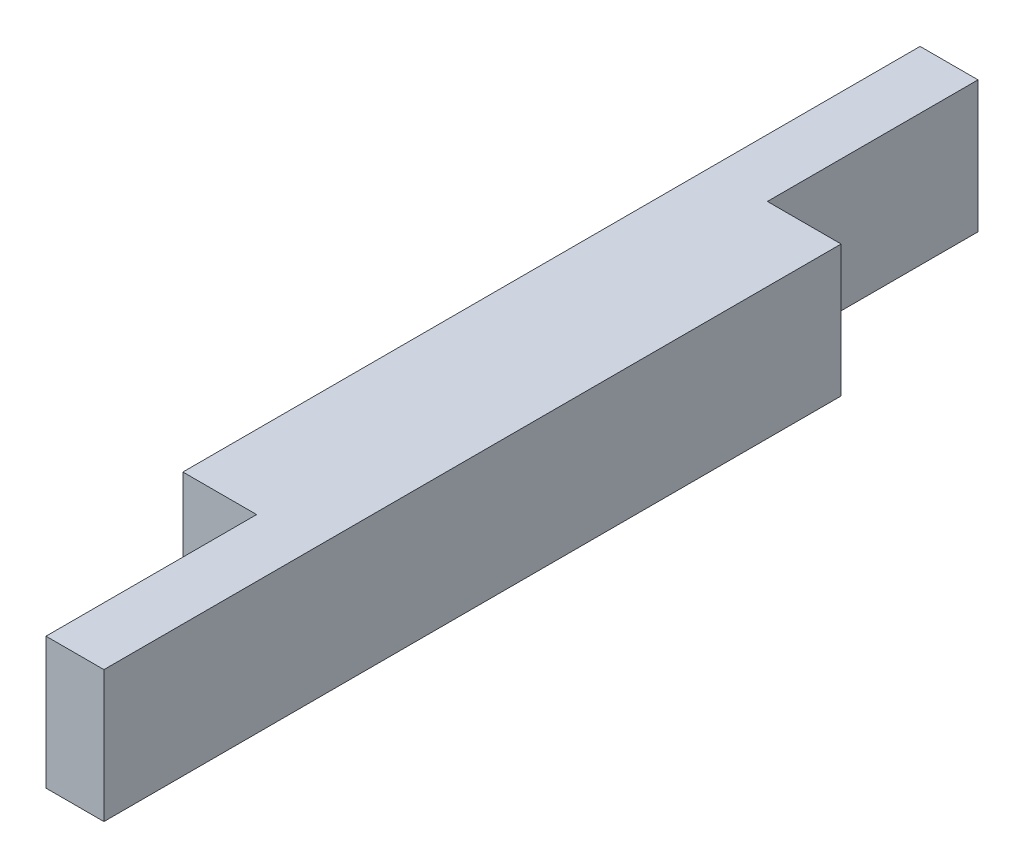
ISO-10303-21;
HEADER;
FILE_DESCRIPTION(('STEP AP214'),'2;1');
FILE_NAME('part.step','',(''),(''),'','','');
FILE_SCHEMA(('AUTOMOTIVE_DESIGN { 1 0 10303 214 1 1 1 1 }'));
ENDSEC;
DATA;
#1=APPLICATION_CONTEXT('core data for automotive mechanical design processes');
#2=APPLICATION_PROTOCOL_DEFINITION('international standard','automotive_design',2000,#1);
#3=PRODUCT_CONTEXT('',#1,'mechanical');
#4=PRODUCT('Part','Part','',(#3));
#5=PRODUCT_RELATED_PRODUCT_CATEGORY('part','',(#4));
#6=PRODUCT_DEFINITION_FORMATION('','',#4);
#7=PRODUCT_DEFINITION_CONTEXT('part definition',#1,'design');
#8=PRODUCT_DEFINITION('design','',#6,#7);
#9=PRODUCT_DEFINITION_SHAPE('','',#8);
#10=(LENGTH_UNIT() NAMED_UNIT(*) SI_UNIT(.MILLI.,.METRE.));
#11=(NAMED_UNIT(*) PLANE_ANGLE_UNIT() SI_UNIT($,.RADIAN.));
#12=(NAMED_UNIT(*) SI_UNIT($,.STERADIAN.) SOLID_ANGLE_UNIT());
#13=UNCERTAINTY_MEASURE_WITH_UNIT(LENGTH_MEASURE(1.E-05),#10,'distance_accuracy_value','');
#14=(GEOMETRIC_REPRESENTATION_CONTEXT(3) GLOBAL_UNCERTAINTY_ASSIGNED_CONTEXT((#13)) GLOBAL_UNIT_ASSIGNED_CONTEXT((#10,
#11,#12)) REPRESENTATION_CONTEXT('',''));
#15=CARTESIAN_POINT('',(0.,0.,0.));
#16=DIRECTION('',(0.,0.,1.));
#17=DIRECTION('',(1.,0.,0.));
#18=AXIS2_PLACEMENT_3D('',#15,#16,#17);
#19=CARTESIAN_POINT('',(12.5,25.,0.));
#20=DIRECTION('',(-1.,0.,0.));
#21=DIRECTION('',(0.,0.,1.));
#22=AXIS2_PLACEMENT_3D('',#19,#20,#21);
#23=PLANE('',#22);
#24=DIRECTION('',(0.,1.,0.));
#25=VECTOR('',#24,1.);
#26=CARTESIAN_POINT('',(12.5,0.,-140.));
#27=LINE('',#26,#25);
#28=CARTESIAN_POINT('',(12.5,0.,-140.));
#29=VERTEX_POINT('',#28);
#30=CARTESIAN_POINT('',(12.5,25.,-140.));
#31=VERTEX_POINT('',#30);
#32=EDGE_CURVE('E142',#29,#31,#27,.T.);
#33=ORIENTED_EDGE('',*,*,#32,.T.);
#34=DIRECTION('',(0.,0.,-1.));
#35=VECTOR('',#34,1.);
#36=CARTESIAN_POINT('',(12.5,25.,0.));
#37=LINE('',#36,#35);
#38=CARTESIAN_POINT('',(12.5,25.,0.));
#39=VERTEX_POINT('',#38);
#40=EDGE_CURVE('E139',#39,#31,#37,.T.);
#41=ORIENTED_EDGE('',*,*,#40,.F.);
#42=DIRECTION('',(0.,-1.,0.));
#43=VECTOR('',#42,1.);
#44=CARTESIAN_POINT('',(12.5,25.,0.));
#45=LINE('',#44,#43);
#46=CARTESIAN_POINT('',(12.5,0.,0.));
#47=VERTEX_POINT('',#46);
#48=EDGE_CURVE('E11',#39,#47,#45,.T.);
#49=ORIENTED_EDGE('',*,*,#48,.T.);
#50=DIRECTION('',(0.,0.,-1.));
#51=VECTOR('',#50,1.);
#52=CARTESIAN_POINT('',(12.5,0.,0.));
#53=LINE('',#52,#51);
#54=EDGE_CURVE('E127',#47,#29,#53,.T.);
#55=ORIENTED_EDGE('',*,*,#54,.T.);
#56=EDGE_LOOP('',(#33,#41,#49,#55));
#57=FACE_BOUND('',#56,.T.);
#58=ADVANCED_FACE('F39',(#57),#23,.F.);
#59=CARTESIAN_POINT('',(0.,25.,0.));
#60=DIRECTION('',(0.,1.,0.));
#61=DIRECTION('',(0.,0.,1.));
#62=AXIS2_PLACEMENT_3D('',#59,#60,#61);
#63=PLANE('',#62);
#64=ORIENTED_EDGE('',*,*,#40,.T.);
#65=DIRECTION('',(-1.,0.,0.));
#66=VECTOR('',#65,1.);
#67=CARTESIAN_POINT('',(0.,25.,-140.));
#68=LINE('',#67,#66);
#69=CARTESIAN_POINT('',(-1.5,25.,-140.));
#70=VERTEX_POINT('',#69);
#71=EDGE_CURVE('E112',#31,#70,#68,.T.);
#72=ORIENTED_EDGE('',*,*,#71,.T.);
#73=DIRECTION('',(0.,0.,1.));
#74=VECTOR('',#73,1.);
#75=CARTESIAN_POINT('',(-1.5,25.,0.));
#76=LINE('',#75,#74);
#77=CARTESIAN_POINT('',(-1.5,25.,-180.));
#78=VERTEX_POINT('',#77);
#79=EDGE_CURVE('E169',#78,#70,#76,.T.);
#80=ORIENTED_EDGE('',*,*,#79,.F.);
#81=DIRECTION('',(1.,0.,0.));
#82=VECTOR('',#81,1.);
#83=CARTESIAN_POINT('',(-12.5000000000001,25.,-180.));
#84=LINE('',#83,#82);
#85=CARTESIAN_POINT('',(-12.5000000000001,25.,-180.));
#86=VERTEX_POINT('',#85);
#87=EDGE_CURVE('E121',#86,#78,#84,.T.);
#88=ORIENTED_EDGE('',*,*,#87,.F.);
#89=DIRECTION('',(0.,0.,-1.));
#90=VECTOR('',#89,1.);
#91=CARTESIAN_POINT('',(-12.5,25.,0.));
#92=LINE('',#91,#90);
#93=CARTESIAN_POINT('',(-12.5,25.,-40.));
#94=VERTEX_POINT('',#93);
#95=EDGE_CURVE('E135',#94,#86,#92,.T.);
#96=ORIENTED_EDGE('',*,*,#95,.F.);
#97=DIRECTION('',(-1.,0.,0.));
#98=VECTOR('',#97,1.);
#99=CARTESIAN_POINT('',(1.5,25.,-40.));
#100=LINE('',#99,#98);
#101=CARTESIAN_POINT('',(1.5,25.,-40.));
#102=VERTEX_POINT('',#101);
#103=EDGE_CURVE('E163',#102,#94,#100,.T.);
#104=ORIENTED_EDGE('',*,*,#103,.F.);
#105=DIRECTION('',(0.,0.,-1.));
#106=VECTOR('',#105,1.);
#107=CARTESIAN_POINT('',(1.5,25.,0.));
#108=LINE('',#107,#106);
#109=CARTESIAN_POINT('',(1.5,25.,0.));
#110=VERTEX_POINT('',#109);
#111=EDGE_CURVE('E165',#110,#102,#108,.T.);
#112=ORIENTED_EDGE('',*,*,#111,.F.);
#113=DIRECTION('',(1.,0.,0.));
#114=VECTOR('',#113,1.);
#115=CARTESIAN_POINT('',(-12.5,25.,0.));
#116=LINE('',#115,#114);
#117=EDGE_CURVE('E129',#110,#39,#116,.T.);
#118=ORIENTED_EDGE('',*,*,#117,.T.);
#119=EDGE_LOOP('',(#64,#72,#80,#88,#96,#104,#112,#118));
#120=FACE_BOUND('',#119,.T.);
#121=ADVANCED_FACE('F175',(#120),#63,.T.);
#122=CARTESIAN_POINT('',(0.,0.,0.));
#123=DIRECTION('',(0.,1.,0.));
#124=DIRECTION('',(0.,0.,1.));
#125=AXIS2_PLACEMENT_3D('',#122,#123,#124);
#126=PLANE('',#125);
#127=DIRECTION('',(-1.,0.,0.));
#128=VECTOR('',#127,1.);
#129=CARTESIAN_POINT('',(0.,0.,-140.));
#130=LINE('',#129,#128);
#131=CARTESIAN_POINT('',(-1.5,0.,-140.));
#132=VERTEX_POINT('',#131);
#133=EDGE_CURVE('E111',#29,#132,#130,.T.);
#134=ORIENTED_EDGE('',*,*,#133,.F.);
#135=ORIENTED_EDGE('',*,*,#54,.F.);
#136=DIRECTION('',(1.,0.,0.));
#137=VECTOR('',#136,1.);
#138=CARTESIAN_POINT('',(-12.5,0.,0.));
#139=LINE('',#138,#137);
#140=CARTESIAN_POINT('',(1.5,0.,0.));
#141=VERTEX_POINT('',#140);
#142=EDGE_CURVE('E132',#141,#47,#139,.T.);
#143=ORIENTED_EDGE('',*,*,#142,.F.);
#144=DIRECTION('',(0.,0.,-1.));
#145=VECTOR('',#144,1.);
#146=CARTESIAN_POINT('',(1.5,0.,0.));
#147=LINE('',#146,#145);
#148=CARTESIAN_POINT('',(1.5,0.,-40.));
#149=VERTEX_POINT('',#148);
#150=EDGE_CURVE('E166',#141,#149,#147,.T.);
#151=ORIENTED_EDGE('',*,*,#150,.T.);
#152=DIRECTION('',(-1.,0.,0.));
#153=VECTOR('',#152,1.);
#154=CARTESIAN_POINT('',(1.5,0.,-40.));
#155=LINE('',#154,#153);
#156=CARTESIAN_POINT('',(-12.5,0.,-40.));
#157=VERTEX_POINT('',#156);
#158=EDGE_CURVE('E159',#149,#157,#155,.T.);
#159=ORIENTED_EDGE('',*,*,#158,.T.);
#160=DIRECTION('',(0.,0.,-1.));
#161=VECTOR('',#160,1.);
#162=CARTESIAN_POINT('',(-12.5,0.,0.));
#163=LINE('',#162,#161);
#164=CARTESIAN_POINT('',(-12.5000000000001,0.,-180.));
#165=VERTEX_POINT('',#164);
#166=EDGE_CURVE('E125',#157,#165,#163,.T.);
#167=ORIENTED_EDGE('',*,*,#166,.T.);
#168=DIRECTION('',(1.,0.,0.));
#169=VECTOR('',#168,1.);
#170=CARTESIAN_POINT('',(-12.5000000000001,0.,-180.));
#171=LINE('',#170,#169);
#172=CARTESIAN_POINT('',(-1.5,0.,-180.));
#173=VERTEX_POINT('',#172);
#174=EDGE_CURVE('E119',#165,#173,#171,.T.);
#175=ORIENTED_EDGE('',*,*,#174,.T.);
#176=DIRECTION('',(0.,0.,1.));
#177=VECTOR('',#176,1.);
#178=CARTESIAN_POINT('',(-1.5,0.,0.));
#179=LINE('',#178,#177);
#180=EDGE_CURVE('E103',#173,#132,#179,.T.);
#181=ORIENTED_EDGE('',*,*,#180,.T.);
#182=EDGE_LOOP('',(#134,#135,#143,#151,#159,#167,#175,#181));
#183=FACE_BOUND('',#182,.T.);
#184=ADVANCED_FACE('F123',(#183),#126,.F.);
#185=CARTESIAN_POINT('',(-12.5,25.,0.));
#186=DIRECTION('',(0.,0.,-1.));
#187=DIRECTION('',(-1.,0.,0.));
#188=AXIS2_PLACEMENT_3D('',#185,#186,#187);
#189=PLANE('',#188);
#190=ORIENTED_EDGE('',*,*,#117,.F.);
#191=DIRECTION('',(0.,1.,0.));
#192=VECTOR('',#191,1.);
#193=CARTESIAN_POINT('',(1.5,0.,0.));
#194=LINE('',#193,#192);
#195=EDGE_CURVE('E161',#141,#110,#194,.T.);
#196=ORIENTED_EDGE('',*,*,#195,.F.);
#197=ORIENTED_EDGE('',*,*,#142,.T.);
#198=ORIENTED_EDGE('',*,*,#48,.F.);
#199=EDGE_LOOP('',(#190,#196,#197,#198));
#200=FACE_BOUND('',#199,.T.);
#201=ADVANCED_FACE('F41',(#200),#189,.F.);
#202=CARTESIAN_POINT('',(-12.5000000000001,25.,-180.));
#203=DIRECTION('',(0.,0.,-1.));
#204=DIRECTION('',(-1.,0.,0.));
#205=AXIS2_PLACEMENT_3D('',#202,#203,#204);
#206=PLANE('',#205);
#207=DIRECTION('',(0.,1.,0.));
#208=VECTOR('',#207,1.);
#209=CARTESIAN_POINT('',(-1.5,0.,-180.));
#210=LINE('',#209,#208);
#211=EDGE_CURVE('E106',#173,#78,#210,.T.);
#212=ORIENTED_EDGE('',*,*,#211,.F.);
#213=ORIENTED_EDGE('',*,*,#174,.F.);
#214=DIRECTION('',(0.,-1.,0.));
#215=VECTOR('',#214,1.);
#216=CARTESIAN_POINT('',(-12.5000000000001,25.,-180.));
#217=LINE('',#216,#215);
#218=EDGE_CURVE('E47',#86,#165,#217,.T.);
#219=ORIENTED_EDGE('',*,*,#218,.F.);
#220=ORIENTED_EDGE('',*,*,#87,.T.);
#221=EDGE_LOOP('',(#212,#213,#219,#220));
#222=FACE_BOUND('',#221,.T.);
#223=ADVANCED_FACE('F117',(#222),#206,.T.);
#224=CARTESIAN_POINT('',(-12.5,25.,0.));
#225=DIRECTION('',(-1.,0.,0.));
#226=DIRECTION('',(0.,0.,1.));
#227=AXIS2_PLACEMENT_3D('',#224,#225,#226);
#228=PLANE('',#227);
#229=DIRECTION('',(0.,1.,0.));
#230=VECTOR('',#229,1.);
#231=CARTESIAN_POINT('',(-12.5,0.,-40.));
#232=LINE('',#231,#230);
#233=EDGE_CURVE('E62',#157,#94,#232,.T.);
#234=ORIENTED_EDGE('',*,*,#233,.T.);
#235=ORIENTED_EDGE('',*,*,#95,.T.);
#236=ORIENTED_EDGE('',*,*,#218,.T.);
#237=ORIENTED_EDGE('',*,*,#166,.F.);
#238=EDGE_LOOP('',(#234,#235,#236,#237));
#239=FACE_BOUND('',#238,.T.);
#240=ADVANCED_FACE('F183',(#239),#228,.T.);
#241=CARTESIAN_POINT('',(1.5,0.,0.));
#242=DIRECTION('',(1.,0.,0.));
#243=DIRECTION('',(0.,0.,-1.));
#244=AXIS2_PLACEMENT_3D('',#241,#242,#243);
#245=PLANE('',#244);
#246=ORIENTED_EDGE('',*,*,#111,.T.);
#247=DIRECTION('',(0.,1.,0.));
#248=VECTOR('',#247,1.);
#249=CARTESIAN_POINT('',(1.5,0.,-40.));
#250=LINE('',#249,#248);
#251=EDGE_CURVE('E157',#149,#102,#250,.T.);
#252=ORIENTED_EDGE('',*,*,#251,.F.);
#253=ORIENTED_EDGE('',*,*,#150,.F.);
#254=ORIENTED_EDGE('',*,*,#195,.T.);
#255=EDGE_LOOP('',(#246,#252,#253,#254));
#256=FACE_BOUND('',#255,.T.);
#257=ADVANCED_FACE('F185',(#256),#245,.F.);
#258=CARTESIAN_POINT('',(1.5,0.,-40.));
#259=DIRECTION('',(0.,0.,-1.));
#260=DIRECTION('',(-1.,0.,0.));
#261=AXIS2_PLACEMENT_3D('',#258,#259,#260);
#262=PLANE('',#261);
#263=ORIENTED_EDGE('',*,*,#103,.T.);
#264=ORIENTED_EDGE('',*,*,#233,.F.);
#265=ORIENTED_EDGE('',*,*,#158,.F.);
#266=ORIENTED_EDGE('',*,*,#251,.T.);
#267=EDGE_LOOP('',(#263,#264,#265,#266));
#268=FACE_BOUND('',#267,.T.);
#269=ADVANCED_FACE('F182',(#268),#262,.F.);
#270=CARTESIAN_POINT('',(0.,0.,-140.));
#271=DIRECTION('',(0.,0.,-1.));
#272=DIRECTION('',(-1.,0.,0.));
#273=AXIS2_PLACEMENT_3D('',#270,#271,#272);
#274=PLANE('',#273);
#275=ORIENTED_EDGE('',*,*,#71,.F.);
#276=ORIENTED_EDGE('',*,*,#32,.F.);
#277=ORIENTED_EDGE('',*,*,#133,.T.);
#278=DIRECTION('',(0.,1.,0.));
#279=VECTOR('',#278,1.);
#280=CARTESIAN_POINT('',(-1.5,0.,-140.));
#281=LINE('',#280,#279);
#282=EDGE_CURVE('E54',#132,#70,#281,.T.);
#283=ORIENTED_EDGE('',*,*,#282,.T.);
#284=EDGE_LOOP('',(#275,#276,#277,#283));
#285=FACE_BOUND('',#284,.T.);
#286=ADVANCED_FACE('F204',(#285),#274,.T.);
#287=CARTESIAN_POINT('',(-1.5,0.,0.));
#288=DIRECTION('',(-1.,0.,0.));
#289=DIRECTION('',(0.,0.,1.));
#290=AXIS2_PLACEMENT_3D('',#287,#288,#289);
#291=PLANE('',#290);
#292=ORIENTED_EDGE('',*,*,#79,.T.);
#293=ORIENTED_EDGE('',*,*,#282,.F.);
#294=ORIENTED_EDGE('',*,*,#180,.F.);
#295=ORIENTED_EDGE('',*,*,#211,.T.);
#296=EDGE_LOOP('',(#292,#293,#294,#295));
#297=FACE_BOUND('',#296,.T.);
#298=ADVANCED_FACE('F105',(#297),#291,.F.);
#299=CLOSED_SHELL('',(#58,#121,#184,#201,#223,#240,#257,#269,#286,#298));
#300=MANIFOLD_SOLID_BREP('B2',#299);
#301=ADVANCED_BREP_SHAPE_REPRESENTATION('',(#18,#300),#14);
#302=SHAPE_DEFINITION_REPRESENTATION(#9,#301);
ENDSEC;
END-ISO-10303-21;
